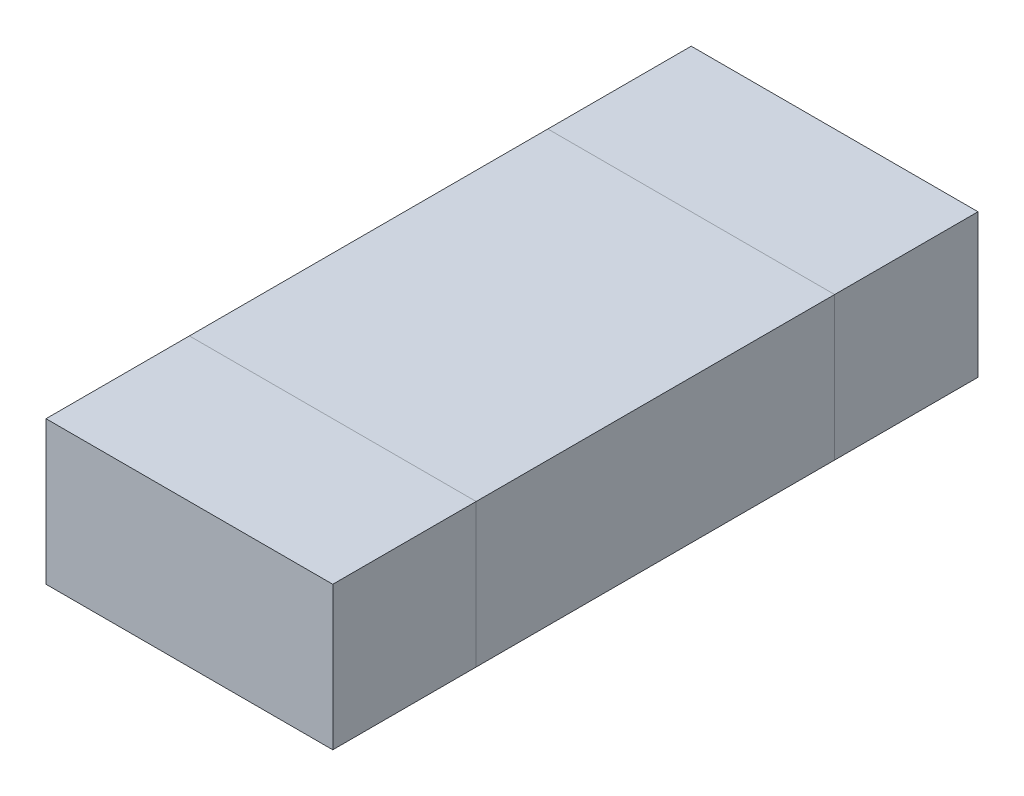
ISO-10303-21;
HEADER;
FILE_DESCRIPTION(('STEP AP214'),'2;1');
FILE_NAME('part.step','',(''),(''),'','','');
FILE_SCHEMA(('AUTOMOTIVE_DESIGN { 1 0 10303 214 1 1 1 1 }'));
ENDSEC;
DATA;
#1=APPLICATION_CONTEXT('core data for automotive mechanical design processes');
#2=APPLICATION_PROTOCOL_DEFINITION('international standard','automotive_design',2000,#1);
#3=PRODUCT_CONTEXT('',#1,'mechanical');
#4=PRODUCT('Part','Part','',(#3));
#5=PRODUCT_RELATED_PRODUCT_CATEGORY('part','',(#4));
#6=PRODUCT_DEFINITION_FORMATION('','',#4);
#7=PRODUCT_DEFINITION_CONTEXT('part definition',#1,'design');
#8=PRODUCT_DEFINITION('design','',#6,#7);
#9=PRODUCT_DEFINITION_SHAPE('','',#8);
#10=(LENGTH_UNIT() NAMED_UNIT(*) SI_UNIT(.MILLI.,.METRE.));
#11=(NAMED_UNIT(*) PLANE_ANGLE_UNIT() SI_UNIT($,.RADIAN.));
#12=(NAMED_UNIT(*) SI_UNIT($,.STERADIAN.) SOLID_ANGLE_UNIT());
#13=UNCERTAINTY_MEASURE_WITH_UNIT(LENGTH_MEASURE(1.E-05),#10,'distance_accuracy_value','');
#14=(GEOMETRIC_REPRESENTATION_CONTEXT(3) GLOBAL_UNCERTAINTY_ASSIGNED_CONTEXT((#13)) GLOBAL_UNIT_ASSIGNED_CONTEXT((#10,
#11,#12)) REPRESENTATION_CONTEXT('',''));
#15=CARTESIAN_POINT('',(0.,0.,0.));
#16=DIRECTION('',(0.,0.,1.));
#17=DIRECTION('',(1.,0.,0.));
#18=AXIS2_PLACEMENT_3D('',#15,#16,#17);
#19=CARTESIAN_POINT('',(0.,0.4,0.));
#20=DIRECTION('',(0.,1.,0.));
#21=DIRECTION('',(0.,0.,1.));
#22=AXIS2_PLACEMENT_3D('',#19,#20,#21);
#23=PLANE('',#22);
#24=DIRECTION('',(0.,0.,-1.));
#25=VECTOR('',#24,1.);
#26=CARTESIAN_POINT('',(-0.4,0.4,-0.5));
#27=LINE('',#26,#25);
#28=CARTESIAN_POINT('',(-0.4,0.4,-0.5));
#29=VERTEX_POINT('',#28);
#30=CARTESIAN_POINT('',(-0.4,0.4,-0.9));
#31=VERTEX_POINT('',#30);
#32=EDGE_CURVE('E56',#29,#31,#27,.T.);
#33=ORIENTED_EDGE('',*,*,#32,.F.);
#34=DIRECTION('',(-1.,0.,0.));
#35=VECTOR('',#34,1.);
#36=CARTESIAN_POINT('',(-0.4,0.4,-0.5));
#37=LINE('',#36,#35);
#38=CARTESIAN_POINT('',(0.4,0.4,-0.5));
#39=VERTEX_POINT('',#38);
#40=EDGE_CURVE('E79',#39,#29,#37,.T.);
#41=ORIENTED_EDGE('',*,*,#40,.F.);
#42=DIRECTION('',(0.,0.,1.));
#43=VECTOR('',#42,1.);
#44=CARTESIAN_POINT('',(0.4,0.4,-0.5));
#45=LINE('',#44,#43);
#46=CARTESIAN_POINT('',(0.4,0.4,-0.9));
#47=VERTEX_POINT('',#46);
#48=EDGE_CURVE('E84',#47,#39,#45,.T.);
#49=ORIENTED_EDGE('',*,*,#48,.F.);
#50=DIRECTION('',(1.,0.,0.));
#51=VECTOR('',#50,1.);
#52=CARTESIAN_POINT('',(-0.4,0.4,-0.9));
#53=LINE('',#52,#51);
#54=EDGE_CURVE('E99',#31,#47,#53,.T.);
#55=ORIENTED_EDGE('',*,*,#54,.F.);
#56=EDGE_LOOP('',(#33,#41,#49,#55));
#57=FACE_BOUND('',#56,.T.);
#58=ADVANCED_FACE('F48',(#57),#23,.T.);
#59=CARTESIAN_POINT('',(0.,0.,0.));
#60=DIRECTION('',(0.,-1.,0.));
#61=DIRECTION('',(0.,0.,-1.));
#62=AXIS2_PLACEMENT_3D('',#59,#60,#61);
#63=PLANE('',#62);
#64=DIRECTION('',(0.,0.,-1.));
#65=VECTOR('',#64,1.);
#66=CARTESIAN_POINT('',(-0.4,0.,-0.5));
#67=LINE('',#66,#65);
#68=CARTESIAN_POINT('',(-0.4,0.,-0.5));
#69=VERTEX_POINT('',#68);
#70=CARTESIAN_POINT('',(-0.4,0.,-0.9));
#71=VERTEX_POINT('',#70);
#72=EDGE_CURVE('E108',#69,#71,#67,.T.);
#73=ORIENTED_EDGE('',*,*,#72,.T.);
#74=DIRECTION('',(1.,0.,0.));
#75=VECTOR('',#74,1.);
#76=CARTESIAN_POINT('',(-0.4,0.,-0.9));
#77=LINE('',#76,#75);
#78=CARTESIAN_POINT('',(0.4,0.,-0.9));
#79=VERTEX_POINT('',#78);
#80=EDGE_CURVE('E97',#71,#79,#77,.T.);
#81=ORIENTED_EDGE('',*,*,#80,.T.);
#82=DIRECTION('',(0.,0.,1.));
#83=VECTOR('',#82,1.);
#84=CARTESIAN_POINT('',(0.4,0.,-0.5));
#85=LINE('',#84,#83);
#86=CARTESIAN_POINT('',(0.4,0.,-0.5));
#87=VERTEX_POINT('',#86);
#88=EDGE_CURVE('E100',#79,#87,#85,.T.);
#89=ORIENTED_EDGE('',*,*,#88,.T.);
#90=DIRECTION('',(-1.,0.,0.));
#91=VECTOR('',#90,1.);
#92=CARTESIAN_POINT('',(-0.4,0.,-0.5));
#93=LINE('',#92,#91);
#94=EDGE_CURVE('E105',#87,#69,#93,.T.);
#95=ORIENTED_EDGE('',*,*,#94,.T.);
#96=EDGE_LOOP('',(#73,#81,#89,#95));
#97=FACE_BOUND('',#96,.T.);
#98=ADVANCED_FACE('F107',(#97),#63,.T.);
#99=CARTESIAN_POINT('',(-0.4,1.29442719099992,-0.9));
#100=DIRECTION('',(0.,0.,-1.));
#101=DIRECTION('',(-1.,0.,0.));
#102=AXIS2_PLACEMENT_3D('',#99,#100,#101);
#103=PLANE('',#102);
#104=DIRECTION('',(0.,-1.,0.));
#105=VECTOR('',#104,1.);
#106=CARTESIAN_POINT('',(-0.4,1.29442719099992,-0.9));
#107=LINE('',#106,#105);
#108=EDGE_CURVE('E12',#31,#71,#107,.T.);
#109=ORIENTED_EDGE('',*,*,#108,.F.);
#110=ORIENTED_EDGE('',*,*,#54,.T.);
#111=DIRECTION('',(0.,-1.,0.));
#112=VECTOR('',#111,1.);
#113=CARTESIAN_POINT('',(0.4,1.29442719099992,-0.9));
#114=LINE('',#113,#112);
#115=EDGE_CURVE('E94',#47,#79,#114,.T.);
#116=ORIENTED_EDGE('',*,*,#115,.T.);
#117=ORIENTED_EDGE('',*,*,#80,.F.);
#118=EDGE_LOOP('',(#109,#110,#116,#117));
#119=FACE_BOUND('',#118,.T.);
#120=ADVANCED_FACE('F95',(#119),#103,.T.);
#121=CARTESIAN_POINT('',(0.4,1.29442719099992,-0.5));
#122=DIRECTION('',(1.,0.,0.));
#123=DIRECTION('',(0.,0.,-1.));
#124=AXIS2_PLACEMENT_3D('',#121,#122,#123);
#125=PLANE('',#124);
#126=ORIENTED_EDGE('',*,*,#115,.F.);
#127=ORIENTED_EDGE('',*,*,#48,.T.);
#128=DIRECTION('',(0.,-1.,0.));
#129=VECTOR('',#128,1.);
#130=CARTESIAN_POINT('',(0.4,1.29442719099992,-0.5));
#131=LINE('',#130,#129);
#132=EDGE_CURVE('E89',#39,#87,#131,.T.);
#133=ORIENTED_EDGE('',*,*,#132,.T.);
#134=ORIENTED_EDGE('',*,*,#88,.F.);
#135=EDGE_LOOP('',(#126,#127,#133,#134));
#136=FACE_BOUND('',#135,.T.);
#137=ADVANCED_FACE('F101',(#136),#125,.T.);
#138=CARTESIAN_POINT('',(-0.4,1.29442719099992,-0.5));
#139=DIRECTION('',(0.,0.,1.));
#140=DIRECTION('',(1.,0.,0.));
#141=AXIS2_PLACEMENT_3D('',#138,#139,#140);
#142=PLANE('',#141);
#143=ORIENTED_EDGE('',*,*,#132,.F.);
#144=ORIENTED_EDGE('',*,*,#40,.T.);
#145=DIRECTION('',(0.,-1.,0.));
#146=VECTOR('',#145,1.);
#147=CARTESIAN_POINT('',(-0.4,1.29442719099992,-0.5));
#148=LINE('',#147,#146);
#149=EDGE_CURVE('E115',#29,#69,#148,.T.);
#150=ORIENTED_EDGE('',*,*,#149,.T.);
#151=ORIENTED_EDGE('',*,*,#94,.F.);
#152=EDGE_LOOP('',(#143,#144,#150,#151));
#153=FACE_BOUND('',#152,.T.);
#154=ADVANCED_FACE('F121',(#153),#142,.T.);
#155=CARTESIAN_POINT('',(-0.4,1.29442719099992,-0.5));
#156=DIRECTION('',(-1.,0.,0.));
#157=DIRECTION('',(0.,0.,1.));
#158=AXIS2_PLACEMENT_3D('',#155,#156,#157);
#159=PLANE('',#158);
#160=ORIENTED_EDGE('',*,*,#149,.F.);
#161=ORIENTED_EDGE('',*,*,#32,.T.);
#162=ORIENTED_EDGE('',*,*,#108,.T.);
#163=ORIENTED_EDGE('',*,*,#72,.F.);
#164=EDGE_LOOP('',(#160,#161,#162,#163));
#165=FACE_BOUND('',#164,.T.);
#166=ADVANCED_FACE('F122',(#165),#159,.T.);
#167=CLOSED_SHELL('',(#58,#98,#120,#137,#154,#166));
#168=MANIFOLD_SOLID_BREP('B2',#167);
#169=CARTESIAN_POINT('',(0.,0.4,0.));
#170=DIRECTION('',(0.,1.,0.));
#171=DIRECTION('',(0.,0.,1.));
#172=AXIS2_PLACEMENT_3D('',#169,#170,#171);
#173=PLANE('',#172);
#174=DIRECTION('',(0.,0.,-1.));
#175=VECTOR('',#174,1.);
#176=CARTESIAN_POINT('',(-0.4,0.4,0.5));
#177=LINE('',#176,#175);
#178=CARTESIAN_POINT('',(-0.4,0.4,0.9));
#179=VERTEX_POINT('',#178);
#180=CARTESIAN_POINT('',(-0.4,0.4,0.5));
#181=VERTEX_POINT('',#180);
#182=EDGE_CURVE('E189',#179,#181,#177,.T.);
#183=ORIENTED_EDGE('',*,*,#182,.F.);
#184=DIRECTION('',(-1.,0.,0.));
#185=VECTOR('',#184,1.);
#186=CARTESIAN_POINT('',(-0.4,0.4,0.9));
#187=LINE('',#186,#185);
#188=CARTESIAN_POINT('',(0.4,0.4,0.9));
#189=VERTEX_POINT('',#188);
#190=EDGE_CURVE('E212',#189,#179,#187,.T.);
#191=ORIENTED_EDGE('',*,*,#190,.F.);
#192=DIRECTION('',(0.,0.,1.));
#193=VECTOR('',#192,1.);
#194=CARTESIAN_POINT('',(0.4,0.4,0.5));
#195=LINE('',#194,#193);
#196=CARTESIAN_POINT('',(0.4,0.4,0.5));
#197=VERTEX_POINT('',#196);
#198=EDGE_CURVE('E217',#197,#189,#195,.T.);
#199=ORIENTED_EDGE('',*,*,#198,.F.);
#200=DIRECTION('',(1.,0.,0.));
#201=VECTOR('',#200,1.);
#202=CARTESIAN_POINT('',(-0.4,0.4,0.5));
#203=LINE('',#202,#201);
#204=EDGE_CURVE('E232',#181,#197,#203,.T.);
#205=ORIENTED_EDGE('',*,*,#204,.F.);
#206=EDGE_LOOP('',(#183,#191,#199,#205));
#207=FACE_BOUND('',#206,.T.);
#208=ADVANCED_FACE('F181',(#207),#173,.T.);
#209=CARTESIAN_POINT('',(0.,0.,0.));
#210=DIRECTION('',(0.,1.,0.));
#211=DIRECTION('',(0.,0.,1.));
#212=AXIS2_PLACEMENT_3D('',#209,#210,#211);
#213=PLANE('',#212);
#214=DIRECTION('',(0.,0.,-1.));
#215=VECTOR('',#214,1.);
#216=CARTESIAN_POINT('',(-0.4,0.,0.5));
#217=LINE('',#216,#215);
#218=CARTESIAN_POINT('',(-0.4,0.,0.9));
#219=VERTEX_POINT('',#218);
#220=CARTESIAN_POINT('',(-0.4,0.,0.5));
#221=VERTEX_POINT('',#220);
#222=EDGE_CURVE('E241',#219,#221,#217,.T.);
#223=ORIENTED_EDGE('',*,*,#222,.T.);
#224=DIRECTION('',(1.,0.,0.));
#225=VECTOR('',#224,1.);
#226=CARTESIAN_POINT('',(-0.4,0.,0.5));
#227=LINE('',#226,#225);
#228=CARTESIAN_POINT('',(0.4,0.,0.5));
#229=VERTEX_POINT('',#228);
#230=EDGE_CURVE('E230',#221,#229,#227,.T.);
#231=ORIENTED_EDGE('',*,*,#230,.T.);
#232=DIRECTION('',(0.,0.,1.));
#233=VECTOR('',#232,1.);
#234=CARTESIAN_POINT('',(0.4,0.,0.5));
#235=LINE('',#234,#233);
#236=CARTESIAN_POINT('',(0.4,0.,0.9));
#237=VERTEX_POINT('',#236);
#238=EDGE_CURVE('E233',#229,#237,#235,.T.);
#239=ORIENTED_EDGE('',*,*,#238,.T.);
#240=DIRECTION('',(-1.,0.,0.));
#241=VECTOR('',#240,1.);
#242=CARTESIAN_POINT('',(-0.4,0.,0.9));
#243=LINE('',#242,#241);
#244=EDGE_CURVE('E238',#237,#219,#243,.T.);
#245=ORIENTED_EDGE('',*,*,#244,.T.);
#246=EDGE_LOOP('',(#223,#231,#239,#245));
#247=FACE_BOUND('',#246,.T.);
#248=ADVANCED_FACE('F240',(#247),#213,.F.);
#249=CARTESIAN_POINT('',(-0.4,1.29442719099992,0.5));
#250=DIRECTION('',(0.,0.,-1.));
#251=DIRECTION('',(-1.,0.,0.));
#252=AXIS2_PLACEMENT_3D('',#249,#250,#251);
#253=PLANE('',#252);
#254=DIRECTION('',(0.,-1.,0.));
#255=VECTOR('',#254,1.);
#256=CARTESIAN_POINT('',(-0.4,1.29442719099992,0.5));
#257=LINE('',#256,#255);
#258=EDGE_CURVE('E46',#181,#221,#257,.T.);
#259=ORIENTED_EDGE('',*,*,#258,.F.);
#260=ORIENTED_EDGE('',*,*,#204,.T.);
#261=DIRECTION('',(0.,-1.,0.));
#262=VECTOR('',#261,1.);
#263=CARTESIAN_POINT('',(0.4,1.29442719099992,0.5));
#264=LINE('',#263,#262);
#265=EDGE_CURVE('E227',#197,#229,#264,.T.);
#266=ORIENTED_EDGE('',*,*,#265,.T.);
#267=ORIENTED_EDGE('',*,*,#230,.F.);
#268=EDGE_LOOP('',(#259,#260,#266,#267));
#269=FACE_BOUND('',#268,.T.);
#270=ADVANCED_FACE('F228',(#269),#253,.T.);
#271=CARTESIAN_POINT('',(0.4,1.29442719099992,0.5));
#272=DIRECTION('',(1.,0.,0.));
#273=DIRECTION('',(0.,0.,-1.));
#274=AXIS2_PLACEMENT_3D('',#271,#272,#273);
#275=PLANE('',#274);
#276=ORIENTED_EDGE('',*,*,#265,.F.);
#277=ORIENTED_EDGE('',*,*,#198,.T.);
#278=DIRECTION('',(0.,-1.,0.));
#279=VECTOR('',#278,1.);
#280=CARTESIAN_POINT('',(0.4,1.29442719099992,0.9));
#281=LINE('',#280,#279);
#282=EDGE_CURVE('E222',#189,#237,#281,.T.);
#283=ORIENTED_EDGE('',*,*,#282,.T.);
#284=ORIENTED_EDGE('',*,*,#238,.F.);
#285=EDGE_LOOP('',(#276,#277,#283,#284));
#286=FACE_BOUND('',#285,.T.);
#287=ADVANCED_FACE('F234',(#286),#275,.T.);
#288=CARTESIAN_POINT('',(-0.4,1.29442719099992,0.9));
#289=DIRECTION('',(0.,0.,1.));
#290=DIRECTION('',(1.,0.,0.));
#291=AXIS2_PLACEMENT_3D('',#288,#289,#290);
#292=PLANE('',#291);
#293=ORIENTED_EDGE('',*,*,#282,.F.);
#294=ORIENTED_EDGE('',*,*,#190,.T.);
#295=DIRECTION('',(0.,-1.,0.));
#296=VECTOR('',#295,1.);
#297=CARTESIAN_POINT('',(-0.4,1.29442719099992,0.9));
#298=LINE('',#297,#296);
#299=EDGE_CURVE('E248',#179,#219,#298,.T.);
#300=ORIENTED_EDGE('',*,*,#299,.T.);
#301=ORIENTED_EDGE('',*,*,#244,.F.);
#302=EDGE_LOOP('',(#293,#294,#300,#301));
#303=FACE_BOUND('',#302,.T.);
#304=ADVANCED_FACE('F254',(#303),#292,.T.);
#305=CARTESIAN_POINT('',(-0.4,1.29442719099992,0.5));
#306=DIRECTION('',(-1.,0.,0.));
#307=DIRECTION('',(0.,0.,1.));
#308=AXIS2_PLACEMENT_3D('',#305,#306,#307);
#309=PLANE('',#308);
#310=ORIENTED_EDGE('',*,*,#299,.F.);
#311=ORIENTED_EDGE('',*,*,#182,.T.);
#312=ORIENTED_EDGE('',*,*,#258,.T.);
#313=ORIENTED_EDGE('',*,*,#222,.F.);
#314=EDGE_LOOP('',(#310,#311,#312,#313));
#315=FACE_BOUND('',#314,.T.);
#316=ADVANCED_FACE('F255',(#315),#309,.T.);
#317=CLOSED_SHELL('',(#208,#248,#270,#287,#304,#316));
#318=MANIFOLD_SOLID_BREP('B6',#317);
#319=CARTESIAN_POINT('',(0.4,0.4,-0.5));
#320=DIRECTION('',(-1.,0.,0.));
#321=DIRECTION('',(0.,0.,1.));
#322=AXIS2_PLACEMENT_3D('',#319,#320,#321);
#323=PLANE('',#322);
#324=DIRECTION('',(0.,0.,-1.));
#325=VECTOR('',#324,1.);
#326=CARTESIAN_POINT('',(0.4,0.,-0.5));
#327=LINE('',#326,#325);
#328=CARTESIAN_POINT('',(0.4,0.,0.5));
#329=VERTEX_POINT('',#328);
#330=CARTESIAN_POINT('',(0.4,0.,-0.5));
#331=VERTEX_POINT('',#330);
#332=EDGE_CURVE('E368',#329,#331,#327,.T.);
#333=ORIENTED_EDGE('',*,*,#332,.T.);
#334=DIRECTION('',(0.,-1.,0.));
#335=VECTOR('',#334,1.);
#336=CARTESIAN_POINT('',(0.4,0.4,-0.5));
#337=LINE('',#336,#335);
#338=CARTESIAN_POINT('',(0.4,0.4,-0.5));
#339=VERTEX_POINT('',#338);
#340=EDGE_CURVE('E179',#339,#331,#337,.T.);
#341=ORIENTED_EDGE('',*,*,#340,.F.);
#342=DIRECTION('',(0.,0.,-1.));
#343=VECTOR('',#342,1.);
#344=CARTESIAN_POINT('',(0.4,0.4,-0.5));
#345=LINE('',#344,#343);
#346=CARTESIAN_POINT('',(0.4,0.4,0.5));
#347=VERTEX_POINT('',#346);
#348=EDGE_CURVE('E356',#347,#339,#345,.T.);
#349=ORIENTED_EDGE('',*,*,#348,.F.);
#350=DIRECTION('',(0.,-1.,0.));
#351=VECTOR('',#350,1.);
#352=CARTESIAN_POINT('',(0.4,0.4,0.5));
#353=LINE('',#352,#351);
#354=EDGE_CURVE('E364',#347,#329,#353,.T.);
#355=ORIENTED_EDGE('',*,*,#354,.T.);
#356=EDGE_LOOP('',(#333,#341,#349,#355));
#357=FACE_BOUND('',#356,.T.);
#358=ADVANCED_FACE('F305',(#357),#323,.F.);
#359=CARTESIAN_POINT('',(-0.4,0.4,-0.5));
#360=DIRECTION('',(0.,0.,1.));
#361=DIRECTION('',(1.,0.,0.));
#362=AXIS2_PLACEMENT_3D('',#359,#360,#361);
#363=PLANE('',#362);
#364=DIRECTION('',(-1.,0.,0.));
#365=VECTOR('',#364,1.);
#366=CARTESIAN_POINT('',(-0.4,0.,-0.5));
#367=LINE('',#366,#365);
#368=CARTESIAN_POINT('',(-0.4,0.,-0.5));
#369=VERTEX_POINT('',#368);
#370=EDGE_CURVE('E360',#331,#369,#367,.T.);
#371=ORIENTED_EDGE('',*,*,#370,.T.);
#372=DIRECTION('',(0.,-1.,0.));
#373=VECTOR('',#372,1.);
#374=CARTESIAN_POINT('',(-0.4,0.4,-0.5));
#375=LINE('',#374,#373);
#376=CARTESIAN_POINT('',(-0.4,0.4,-0.5));
#377=VERTEX_POINT('',#376);
#378=EDGE_CURVE('E313',#377,#369,#375,.T.);
#379=ORIENTED_EDGE('',*,*,#378,.F.);
#380=DIRECTION('',(-1.,0.,0.));
#381=VECTOR('',#380,1.);
#382=CARTESIAN_POINT('',(-0.4,0.4,-0.5));
#383=LINE('',#382,#381);
#384=EDGE_CURVE('E351',#339,#377,#383,.T.);
#385=ORIENTED_EDGE('',*,*,#384,.F.);
#386=ORIENTED_EDGE('',*,*,#340,.T.);
#387=EDGE_LOOP('',(#371,#379,#385,#386));
#388=FACE_BOUND('',#387,.T.);
#389=ADVANCED_FACE('F359',(#388),#363,.F.);
#390=CARTESIAN_POINT('',(-0.4,0.4,-0.5));
#391=DIRECTION('',(1.,0.,0.));
#392=DIRECTION('',(0.,0.,-1.));
#393=AXIS2_PLACEMENT_3D('',#390,#391,#392);
#394=PLANE('',#393);
#395=DIRECTION('',(0.,0.,1.));
#396=VECTOR('',#395,1.);
#397=CARTESIAN_POINT('',(-0.4,0.,-0.5));
#398=LINE('',#397,#396);
#399=CARTESIAN_POINT('',(-0.4,0.,0.5));
#400=VERTEX_POINT('',#399);
#401=EDGE_CURVE('E338',#369,#400,#398,.T.);
#402=ORIENTED_EDGE('',*,*,#401,.T.);
#403=DIRECTION('',(0.,-1.,0.));
#404=VECTOR('',#403,1.);
#405=CARTESIAN_POINT('',(-0.4,0.4,0.5));
#406=LINE('',#405,#404);
#407=CARTESIAN_POINT('',(-0.4,0.4,0.5));
#408=VERTEX_POINT('',#407);
#409=EDGE_CURVE('E361',#408,#400,#406,.T.);
#410=ORIENTED_EDGE('',*,*,#409,.F.);
#411=DIRECTION('',(0.,0.,1.));
#412=VECTOR('',#411,1.);
#413=CARTESIAN_POINT('',(-0.4,0.4,-0.5));
#414=LINE('',#413,#412);
#415=EDGE_CURVE('E354',#377,#408,#414,.T.);
#416=ORIENTED_EDGE('',*,*,#415,.F.);
#417=ORIENTED_EDGE('',*,*,#378,.T.);
#418=EDGE_LOOP('',(#402,#410,#416,#417));
#419=FACE_BOUND('',#418,.T.);
#420=ADVANCED_FACE('F362',(#419),#394,.F.);
#421=CARTESIAN_POINT('',(-0.4,0.4,0.5));
#422=DIRECTION('',(0.,0.,-1.));
#423=DIRECTION('',(-1.,0.,0.));
#424=AXIS2_PLACEMENT_3D('',#421,#422,#423);
#425=PLANE('',#424);
#426=DIRECTION('',(1.,0.,0.));
#427=VECTOR('',#426,1.);
#428=CARTESIAN_POINT('',(-0.4,0.,0.5));
#429=LINE('',#428,#427);
#430=EDGE_CURVE('E344',#400,#329,#429,.T.);
#431=ORIENTED_EDGE('',*,*,#430,.T.);
#432=ORIENTED_EDGE('',*,*,#354,.F.);
#433=DIRECTION('',(1.,0.,0.));
#434=VECTOR('',#433,1.);
#435=CARTESIAN_POINT('',(-0.4,0.4,0.5));
#436=LINE('',#435,#434);
#437=EDGE_CURVE('E321',#408,#347,#436,.T.);
#438=ORIENTED_EDGE('',*,*,#437,.F.);
#439=ORIENTED_EDGE('',*,*,#409,.T.);
#440=EDGE_LOOP('',(#431,#432,#438,#439));
#441=FACE_BOUND('',#440,.T.);
#442=ADVANCED_FACE('F375',(#441),#425,.F.);
#443=CARTESIAN_POINT('',(0.,0.4,0.));
#444=DIRECTION('',(0.,1.,0.));
#445=DIRECTION('',(0.,0.,1.));
#446=AXIS2_PLACEMENT_3D('',#443,#444,#445);
#447=PLANE('',#446);
#448=ORIENTED_EDGE('',*,*,#348,.T.);
#449=ORIENTED_EDGE('',*,*,#384,.T.);
#450=ORIENTED_EDGE('',*,*,#415,.T.);
#451=ORIENTED_EDGE('',*,*,#437,.T.);
#452=EDGE_LOOP('',(#448,#449,#450,#451));
#453=FACE_BOUND('',#452,.T.);
#454=ADVANCED_FACE('F352',(#453),#447,.T.);
#455=CARTESIAN_POINT('',(0.,0.,0.));
#456=DIRECTION('',(0.,1.,0.));
#457=DIRECTION('',(0.,0.,1.));
#458=AXIS2_PLACEMENT_3D('',#455,#456,#457);
#459=PLANE('',#458);
#460=ORIENTED_EDGE('',*,*,#332,.F.);
#461=ORIENTED_EDGE('',*,*,#430,.F.);
#462=ORIENTED_EDGE('',*,*,#401,.F.);
#463=ORIENTED_EDGE('',*,*,#370,.F.);
#464=EDGE_LOOP('',(#460,#461,#462,#463));
#465=FACE_BOUND('',#464,.T.);
#466=ADVANCED_FACE('F378',(#465),#459,.F.);
#467=CLOSED_SHELL('',(#358,#389,#420,#442,#454,#466));
#468=MANIFOLD_SOLID_BREP('B40',#467);
#469=ADVANCED_BREP_SHAPE_REPRESENTATION('',(#18,#168,#318,#468),#14);
#470=SHAPE_DEFINITION_REPRESENTATION(#9,#469);
ENDSEC;
END-ISO-10303-21;
